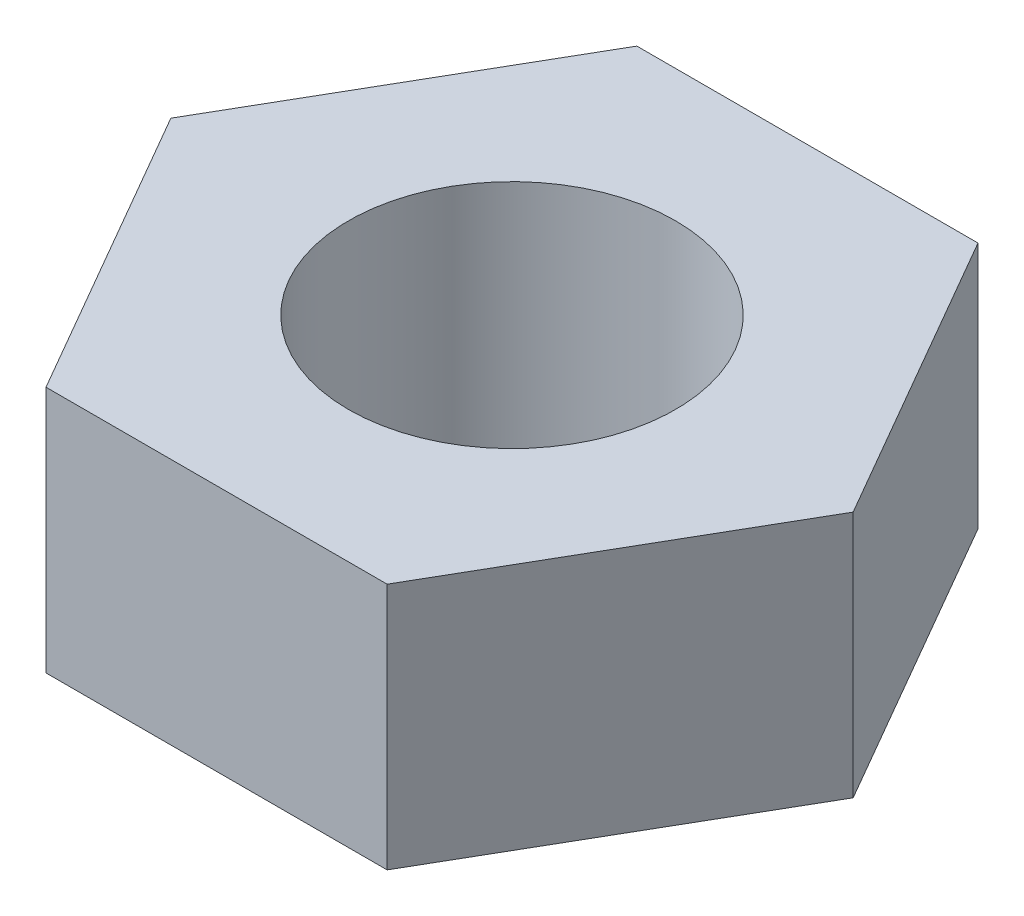
ISO-10303-21;
HEADER;
FILE_DESCRIPTION(('STEP AP214'),'2;1');
FILE_NAME('part.step','',(''),(''),'','','');
FILE_SCHEMA(('AUTOMOTIVE_DESIGN { 1 0 10303 214 1 1 1 1 }'));
ENDSEC;
DATA;
#1=APPLICATION_CONTEXT('core data for automotive mechanical design processes');
#2=APPLICATION_PROTOCOL_DEFINITION('international standard','automotive_design',2000,#1);
#3=PRODUCT_CONTEXT('',#1,'mechanical');
#4=PRODUCT('Part','Part','',(#3));
#5=PRODUCT_RELATED_PRODUCT_CATEGORY('part','',(#4));
#6=PRODUCT_DEFINITION_FORMATION('','',#4);
#7=PRODUCT_DEFINITION_CONTEXT('part definition',#1,'design');
#8=PRODUCT_DEFINITION('design','',#6,#7);
#9=PRODUCT_DEFINITION_SHAPE('','',#8);
#10=(LENGTH_UNIT() NAMED_UNIT(*) SI_UNIT(.MILLI.,.METRE.));
#11=(NAMED_UNIT(*) PLANE_ANGLE_UNIT() SI_UNIT($,.RADIAN.));
#12=(NAMED_UNIT(*) SI_UNIT($,.STERADIAN.) SOLID_ANGLE_UNIT());
#13=UNCERTAINTY_MEASURE_WITH_UNIT(LENGTH_MEASURE(1.E-05),#10,'distance_accuracy_value','');
#14=(GEOMETRIC_REPRESENTATION_CONTEXT(3) GLOBAL_UNCERTAINTY_ASSIGNED_CONTEXT((#13)) GLOBAL_UNIT_ASSIGNED_CONTEXT((#10,
#11,#12)) REPRESENTATION_CONTEXT('',''));
#15=CARTESIAN_POINT('',(0.,0.,0.));
#16=DIRECTION('',(0.,0.,1.));
#17=DIRECTION('',(1.,0.,0.));
#18=AXIS2_PLACEMENT_3D('',#15,#16,#17);
#19=CARTESIAN_POINT('',(1.56461922950389,2.27,2.71));
#20=DIRECTION('',(-0.866025403784439,0.,-0.5));
#21=DIRECTION('',(-0.5,0.,0.866025403784439));
#22=AXIS2_PLACEMENT_3D('',#19,#20,#21);
#23=PLANE('',#22);
#24=DIRECTION('',(0.5,0.,-0.866025403784439));
#25=VECTOR('',#24,1.);
#26=CARTESIAN_POINT('',(1.56461922950389,0.,2.71));
#27=LINE('',#26,#25);
#28=CARTESIAN_POINT('',(1.56461922950389,0.,2.71));
#29=VERTEX_POINT('',#28);
#30=CARTESIAN_POINT('',(3.12923845900777,0.,0.));
#31=VERTEX_POINT('',#30);
#32=EDGE_CURVE('E117',#29,#31,#27,.T.);
#33=ORIENTED_EDGE('',*,*,#32,.T.);
#34=DIRECTION('',(0.,-1.,0.));
#35=VECTOR('',#34,1.);
#36=CARTESIAN_POINT('',(3.12923845900777,2.27,0.));
#37=LINE('',#36,#35);
#38=CARTESIAN_POINT('',(3.12923845900777,2.27,0.));
#39=VERTEX_POINT('',#38);
#40=EDGE_CURVE('E11',#39,#31,#37,.T.);
#41=ORIENTED_EDGE('',*,*,#40,.F.);
#42=DIRECTION('',(0.5,0.,-0.866025403784439));
#43=VECTOR('',#42,1.);
#44=CARTESIAN_POINT('',(1.56461922950389,2.27,2.71));
#45=LINE('',#44,#43);
#46=CARTESIAN_POINT('',(1.56461922950389,2.27,2.71));
#47=VERTEX_POINT('',#46);
#48=EDGE_CURVE('E128',#47,#39,#45,.T.);
#49=ORIENTED_EDGE('',*,*,#48,.F.);
#50=DIRECTION('',(0.,-1.,0.));
#51=VECTOR('',#50,1.);
#52=CARTESIAN_POINT('',(1.56461922950389,2.27,2.71));
#53=LINE('',#52,#51);
#54=EDGE_CURVE('E113',#47,#29,#53,.T.);
#55=ORIENTED_EDGE('',*,*,#54,.T.);
#56=EDGE_LOOP('',(#33,#41,#49,#55));
#57=FACE_BOUND('',#56,.T.);
#58=ADVANCED_FACE('F33',(#57),#23,.F.);
#59=CARTESIAN_POINT('',(3.12923845900777,2.27,0.));
#60=DIRECTION('',(-0.866025403784439,0.,0.5));
#61=DIRECTION('',(0.5,0.,0.866025403784439));
#62=AXIS2_PLACEMENT_3D('',#59,#60,#61);
#63=PLANE('',#62);
#64=DIRECTION('',(-0.5,0.,-0.866025403784439));
#65=VECTOR('',#64,1.);
#66=CARTESIAN_POINT('',(3.12923845900777,0.,0.));
#67=LINE('',#66,#65);
#68=CARTESIAN_POINT('',(1.56461922950388,0.,-2.71));
#69=VERTEX_POINT('',#68);
#70=EDGE_CURVE('E120',#31,#69,#67,.T.);
#71=ORIENTED_EDGE('',*,*,#70,.T.);
#72=DIRECTION('',(0.,-1.,0.));
#73=VECTOR('',#72,1.);
#74=CARTESIAN_POINT('',(1.56461922950388,2.27,-2.71));
#75=LINE('',#74,#73);
#76=CARTESIAN_POINT('',(1.56461922950388,2.27,-2.71));
#77=VERTEX_POINT('',#76);
#78=EDGE_CURVE('E41',#77,#69,#75,.T.);
#79=ORIENTED_EDGE('',*,*,#78,.F.);
#80=DIRECTION('',(-0.5,0.,-0.866025403784439));
#81=VECTOR('',#80,1.);
#82=CARTESIAN_POINT('',(3.12923845900777,2.27,0.));
#83=LINE('',#82,#81);
#84=EDGE_CURVE('E86',#39,#77,#83,.T.);
#85=ORIENTED_EDGE('',*,*,#84,.F.);
#86=ORIENTED_EDGE('',*,*,#40,.T.);
#87=EDGE_LOOP('',(#71,#79,#85,#86));
#88=FACE_BOUND('',#87,.T.);
#89=ADVANCED_FACE('F153',(#88),#63,.F.);
#90=CARTESIAN_POINT('',(1.56461922950388,2.27,-2.71));
#91=DIRECTION('',(0.,0.,1.));
#92=DIRECTION('',(1.,0.,0.));
#93=AXIS2_PLACEMENT_3D('',#90,#91,#92);
#94=PLANE('',#93);
#95=DIRECTION('',(-1.,0.,0.));
#96=VECTOR('',#95,1.);
#97=CARTESIAN_POINT('',(1.56461922950388,0.,-2.71));
#98=LINE('',#97,#96);
#99=CARTESIAN_POINT('',(-1.56461922950389,0.,-2.71));
#100=VERTEX_POINT('',#99);
#101=EDGE_CURVE('E123',#69,#100,#98,.T.);
#102=ORIENTED_EDGE('',*,*,#101,.T.);
#103=DIRECTION('',(0.,-1.,0.));
#104=VECTOR('',#103,1.);
#105=CARTESIAN_POINT('',(-1.56461922950389,2.27,-2.71));
#106=LINE('',#105,#104);
#107=CARTESIAN_POINT('',(-1.56461922950389,2.27,-2.71));
#108=VERTEX_POINT('',#107);
#109=EDGE_CURVE('E108',#108,#100,#106,.T.);
#110=ORIENTED_EDGE('',*,*,#109,.F.);
#111=DIRECTION('',(-1.,0.,0.));
#112=VECTOR('',#111,1.);
#113=CARTESIAN_POINT('',(1.56461922950388,2.27,-2.71));
#114=LINE('',#113,#112);
#115=EDGE_CURVE('E99',#77,#108,#114,.T.);
#116=ORIENTED_EDGE('',*,*,#115,.F.);
#117=ORIENTED_EDGE('',*,*,#78,.T.);
#118=EDGE_LOOP('',(#102,#110,#116,#117));
#119=FACE_BOUND('',#118,.T.);
#120=ADVANCED_FACE('F134',(#119),#94,.F.);
#121=CARTESIAN_POINT('',(-1.56461922950389,2.27,-2.71));
#122=DIRECTION('',(0.866025403784439,0.,0.5));
#123=DIRECTION('',(0.5,0.,-0.866025403784439));
#124=AXIS2_PLACEMENT_3D('',#121,#122,#123);
#125=PLANE('',#124);
#126=DIRECTION('',(-0.5,0.,0.866025403784439));
#127=VECTOR('',#126,1.);
#128=CARTESIAN_POINT('',(-1.56461922950389,0.,-2.71));
#129=LINE('',#128,#127);
#130=CARTESIAN_POINT('',(-3.12923845900778,0.,0.));
#131=VERTEX_POINT('',#130);
#132=EDGE_CURVE('E107',#100,#131,#129,.T.);
#133=ORIENTED_EDGE('',*,*,#132,.T.);
#134=DIRECTION('',(0.,-1.,0.));
#135=VECTOR('',#134,1.);
#136=CARTESIAN_POINT('',(-3.12923845900778,2.27,0.));
#137=LINE('',#136,#135);
#138=CARTESIAN_POINT('',(-3.12923845900778,2.27,0.));
#139=VERTEX_POINT('',#138);
#140=EDGE_CURVE('E104',#139,#131,#137,.T.);
#141=ORIENTED_EDGE('',*,*,#140,.F.);
#142=DIRECTION('',(-0.5,0.,0.866025403784439));
#143=VECTOR('',#142,1.);
#144=CARTESIAN_POINT('',(-1.56461922950389,2.27,-2.71));
#145=LINE('',#144,#143);
#146=EDGE_CURVE('E93',#108,#139,#145,.T.);
#147=ORIENTED_EDGE('',*,*,#146,.F.);
#148=ORIENTED_EDGE('',*,*,#109,.T.);
#149=EDGE_LOOP('',(#133,#141,#147,#148));
#150=FACE_BOUND('',#149,.T.);
#151=ADVANCED_FACE('F105',(#150),#125,.F.);
#152=CARTESIAN_POINT('',(-3.12923845900778,2.27,0.));
#153=DIRECTION('',(0.866025403784439,0.,-0.5));
#154=DIRECTION('',(-0.5,0.,-0.866025403784439));
#155=AXIS2_PLACEMENT_3D('',#152,#153,#154);
#156=PLANE('',#155);
#157=DIRECTION('',(0.5,0.,0.866025403784439));
#158=VECTOR('',#157,1.);
#159=CARTESIAN_POINT('',(-3.12923845900778,0.,0.));
#160=LINE('',#159,#158);
#161=CARTESIAN_POINT('',(-1.56461922950389,0.,2.71));
#162=VERTEX_POINT('',#161);
#163=EDGE_CURVE('E72',#131,#162,#160,.T.);
#164=ORIENTED_EDGE('',*,*,#163,.T.);
#165=DIRECTION('',(0.,-1.,0.));
#166=VECTOR('',#165,1.);
#167=CARTESIAN_POINT('',(-1.56461922950389,2.27,2.71));
#168=LINE('',#167,#166);
#169=CARTESIAN_POINT('',(-1.56461922950389,2.27,2.71));
#170=VERTEX_POINT('',#169);
#171=EDGE_CURVE('E109',#170,#162,#168,.T.);
#172=ORIENTED_EDGE('',*,*,#171,.F.);
#173=DIRECTION('',(0.5,0.,0.866025403784439));
#174=VECTOR('',#173,1.);
#175=CARTESIAN_POINT('',(-3.12923845900778,2.27,0.));
#176=LINE('',#175,#174);
#177=EDGE_CURVE('E97',#139,#170,#176,.T.);
#178=ORIENTED_EDGE('',*,*,#177,.F.);
#179=ORIENTED_EDGE('',*,*,#140,.T.);
#180=EDGE_LOOP('',(#164,#172,#178,#179));
#181=FACE_BOUND('',#180,.T.);
#182=ADVANCED_FACE('F111',(#181),#156,.F.);
#183=CARTESIAN_POINT('',(-1.56461922950389,2.27,2.71));
#184=DIRECTION('',(0.,0.,-1.));
#185=DIRECTION('',(-1.,0.,0.));
#186=AXIS2_PLACEMENT_3D('',#183,#184,#185);
#187=PLANE('',#186);
#188=DIRECTION('',(1.,0.,0.));
#189=VECTOR('',#188,1.);
#190=CARTESIAN_POINT('',(-1.56461922950389,0.,2.71));
#191=LINE('',#190,#189);
#192=EDGE_CURVE('E78',#162,#29,#191,.T.);
#193=ORIENTED_EDGE('',*,*,#192,.T.);
#194=ORIENTED_EDGE('',*,*,#54,.F.);
#195=DIRECTION('',(1.,0.,0.));
#196=VECTOR('',#195,1.);
#197=CARTESIAN_POINT('',(-1.56461922950389,2.27,2.71));
#198=LINE('',#197,#196);
#199=EDGE_CURVE('E49',#170,#47,#198,.T.);
#200=ORIENTED_EDGE('',*,*,#199,.F.);
#201=ORIENTED_EDGE('',*,*,#171,.T.);
#202=EDGE_LOOP('',(#193,#194,#200,#201));
#203=FACE_BOUND('',#202,.T.);
#204=ADVANCED_FACE('F141',(#203),#187,.F.);
#205=CARTESIAN_POINT('',(0.,2.27,0.));
#206=DIRECTION('',(0.,1.,0.));
#207=DIRECTION('',(0.,0.,1.));
#208=AXIS2_PLACEMENT_3D('',#205,#206,#207);
#209=PLANE('',#208);
#210=CARTESIAN_POINT('',(0.,2.27,0.));
#211=DIRECTION('',(0.,1.,0.));
#212=DIRECTION('',(0.,0.,1.));
#213=AXIS2_PLACEMENT_3D('',#210,#211,#212);
#214=CIRCLE('',#213,1.5);
#215=CARTESIAN_POINT('',(0.,2.27,1.5));
#216=VERTEX_POINT('',#215);
#217=EDGE_CURVE('E208',#216,#216,#214,.T.);
#218=ORIENTED_EDGE('',*,*,#217,.F.);
#219=EDGE_LOOP('',(#218));
#220=FACE_BOUND('',#219,.T.);
#221=ORIENTED_EDGE('',*,*,#48,.T.);
#222=ORIENTED_EDGE('',*,*,#84,.T.);
#223=ORIENTED_EDGE('',*,*,#115,.T.);
#224=ORIENTED_EDGE('',*,*,#146,.T.);
#225=ORIENTED_EDGE('',*,*,#177,.T.);
#226=ORIENTED_EDGE('',*,*,#199,.T.);
#227=EDGE_LOOP('',(#221,#222,#223,#224,#225,#226));
#228=FACE_BOUND('',#227,.T.);
#229=ADVANCED_FACE('F95',(#220,#228),#209,.T.);
#230=CARTESIAN_POINT('',(0.,0.,0.));
#231=DIRECTION('',(0.,1.,0.));
#232=DIRECTION('',(0.,0.,1.));
#233=AXIS2_PLACEMENT_3D('',#230,#231,#232);
#234=PLANE('',#233);
#235=CARTESIAN_POINT('',(0.,0.,0.));
#236=DIRECTION('',(0.,1.,0.));
#237=DIRECTION('',(0.,0.,1.));
#238=AXIS2_PLACEMENT_3D('',#235,#236,#237);
#239=CIRCLE('',#238,1.5);
#240=CARTESIAN_POINT('',(0.,0.,1.5));
#241=VERTEX_POINT('',#240);
#242=EDGE_CURVE('E121',#241,#241,#239,.T.);
#243=ORIENTED_EDGE('',*,*,#242,.T.);
#244=EDGE_LOOP('',(#243));
#245=FACE_BOUND('',#244,.T.);
#246=ORIENTED_EDGE('',*,*,#32,.F.);
#247=ORIENTED_EDGE('',*,*,#192,.F.);
#248=ORIENTED_EDGE('',*,*,#163,.F.);
#249=ORIENTED_EDGE('',*,*,#132,.F.);
#250=ORIENTED_EDGE('',*,*,#101,.F.);
#251=ORIENTED_EDGE('',*,*,#70,.F.);
#252=EDGE_LOOP('',(#246,#247,#248,#249,#250,#251));
#253=FACE_BOUND('',#252,.T.);
#254=ADVANCED_FACE('F137',(#245,#253),#234,.F.);
#255=CARTESIAN_POINT('',(0.,0.,0.));
#256=DIRECTION('',(0.,1.,0.));
#257=DIRECTION('',(0.,0.,1.));
#258=AXIS2_PLACEMENT_3D('',#255,#256,#257);
#259=CYLINDRICAL_SURFACE('',#258,1.5);
#260=ORIENTED_EDGE('',*,*,#242,.F.);
#261=EDGE_LOOP('',(#260));
#262=FACE_BOUND('',#261,.T.);
#263=ORIENTED_EDGE('',*,*,#217,.T.);
#264=EDGE_LOOP('',(#263));
#265=FACE_BOUND('',#264,.T.);
#266=ADVANCED_FACE('F190',(#262,#265),#259,.F.);
#267=CLOSED_SHELL('',(#58,#89,#120,#151,#182,#204,#229,#254,#266));
#268=MANIFOLD_SOLID_BREP('B2',#267);
#269=ADVANCED_BREP_SHAPE_REPRESENTATION('',(#18,#268),#14);
#270=SHAPE_DEFINITION_REPRESENTATION(#9,#269);
ENDSEC;
END-ISO-10303-21;
